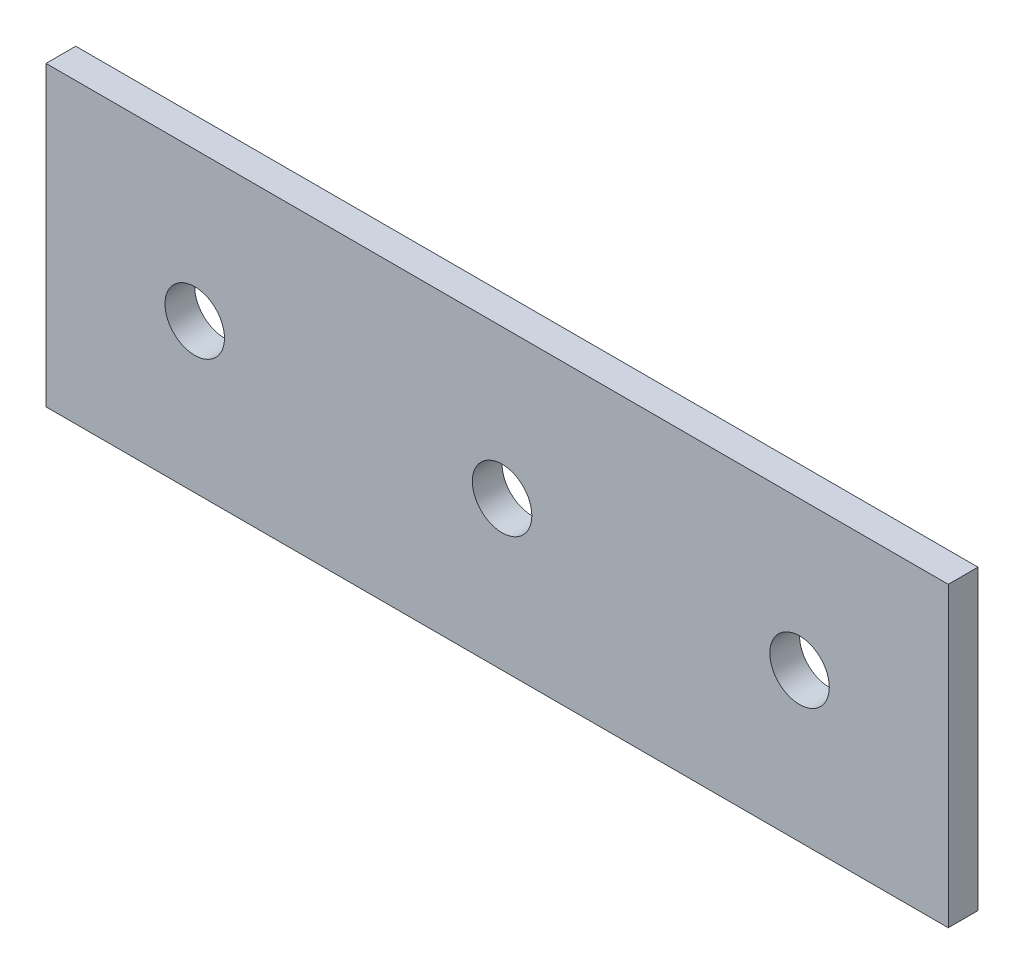
ISO-10303-21;
HEADER;
FILE_DESCRIPTION(('STEP AP214'),'2;1');
FILE_NAME('part.step','',(''),(''),'','','');
FILE_SCHEMA(('AUTOMOTIVE_DESIGN { 1 0 10303 214 1 1 1 1 }'));
ENDSEC;
DATA;
#1=APPLICATION_CONTEXT('core data for automotive mechanical design processes');
#2=APPLICATION_PROTOCOL_DEFINITION('international standard','automotive_design',2000,#1);
#3=PRODUCT_CONTEXT('',#1,'mechanical');
#4=PRODUCT('Part','Part','',(#3));
#5=PRODUCT_RELATED_PRODUCT_CATEGORY('part','',(#4));
#6=PRODUCT_DEFINITION_FORMATION('','',#4);
#7=PRODUCT_DEFINITION_CONTEXT('part definition',#1,'design');
#8=PRODUCT_DEFINITION('design','',#6,#7);
#9=PRODUCT_DEFINITION_SHAPE('','',#8);
#10=(LENGTH_UNIT() NAMED_UNIT(*) SI_UNIT(.MILLI.,.METRE.));
#11=(NAMED_UNIT(*) PLANE_ANGLE_UNIT() SI_UNIT($,.RADIAN.));
#12=(NAMED_UNIT(*) SI_UNIT($,.STERADIAN.) SOLID_ANGLE_UNIT());
#13=UNCERTAINTY_MEASURE_WITH_UNIT(LENGTH_MEASURE(1.E-05),#10,'distance_accuracy_value','');
#14=(GEOMETRIC_REPRESENTATION_CONTEXT(3) GLOBAL_UNCERTAINTY_ASSIGNED_CONTEXT((#13)) GLOBAL_UNIT_ASSIGNED_CONTEXT((#10,
#11,#12)) REPRESENTATION_CONTEXT('',''));
#15=CARTESIAN_POINT('',(0.,0.,0.));
#16=DIRECTION('',(0.,0.,1.));
#17=DIRECTION('',(1.,0.,0.));
#18=AXIS2_PLACEMENT_3D('',#15,#16,#17);
#19=CARTESIAN_POINT('',(-36.0672653272042,-0.000631578947363209,1.5));
#20=DIRECTION('',(0.,0.,1.));
#21=DIRECTION('',(1.,0.,0.));
#22=AXIS2_PLACEMENT_3D('',#19,#20,#21);
#23=PLANE('',#22);
#24=CARTESIAN_POINT('',(1.93273467279583,7.49936842105264,1.5));
#25=DIRECTION('',(0.,0.,1.));
#26=DIRECTION('',(1.,0.,0.));
#27=AXIS2_PLACEMENT_3D('',#24,#25,#26);
#28=CIRCLE('',#27,1.5);
#29=CARTESIAN_POINT('',(3.43273467279583,7.49936842105264,1.5));
#30=VERTEX_POINT('',#29);
#31=EDGE_CURVE('E113',#30,#30,#28,.T.);
#32=ORIENTED_EDGE('',*,*,#31,.F.);
#33=EDGE_LOOP('',(#32));
#34=FACE_BOUND('',#33,.T.);
#35=DIRECTION('',(0.,-1.,0.));
#36=VECTOR('',#35,1.);
#37=CARTESIAN_POINT('',(-36.0672653272042,14.9993684210526,1.5));
#38=LINE('',#37,#36);
#39=CARTESIAN_POINT('',(-36.0672653272042,14.9993684210526,1.5));
#40=VERTEX_POINT('',#39);
#41=CARTESIAN_POINT('',(-36.0672653272042,-0.000631578947363209,1.5));
#42=VERTEX_POINT('',#41);
#43=EDGE_CURVE('E83',#40,#42,#38,.T.);
#44=ORIENTED_EDGE('',*,*,#43,.T.);
#45=DIRECTION('',(1.,0.,0.));
#46=VECTOR('',#45,1.);
#47=CARTESIAN_POINT('',(-36.0672653272042,-0.000631578947363209,1.5));
#48=LINE('',#47,#46);
#49=CARTESIAN_POINT('',(9.43273467279583,-0.000631578947363209,1.5));
#50=VERTEX_POINT('',#49);
#51=EDGE_CURVE('E78',#42,#50,#48,.T.);
#52=ORIENTED_EDGE('',*,*,#51,.T.);
#53=DIRECTION('',(0.,1.,0.));
#54=VECTOR('',#53,1.);
#55=CARTESIAN_POINT('',(9.43273467279583,14.9993684210526,1.5));
#56=LINE('',#55,#54);
#57=CARTESIAN_POINT('',(9.43273467279583,14.9993684210526,1.5));
#58=VERTEX_POINT('',#57);
#59=EDGE_CURVE('E81',#50,#58,#56,.T.);
#60=ORIENTED_EDGE('',*,*,#59,.T.);
#61=DIRECTION('',(-1.,0.,0.));
#62=VECTOR('',#61,1.);
#63=CARTESIAN_POINT('',(-36.0672653272042,14.9993684210526,1.5));
#64=LINE('',#63,#62);
#65=EDGE_CURVE('E48',#58,#40,#64,.T.);
#66=ORIENTED_EDGE('',*,*,#65,.T.);
#67=EDGE_LOOP('',(#44,#52,#60,#66));
#68=FACE_BOUND('',#67,.T.);
#69=CARTESIAN_POINT('',(-28.5672653272042,7.49936842105264,1.5));
#70=DIRECTION('',(0.,0.,1.));
#71=DIRECTION('',(1.,0.,0.));
#72=AXIS2_PLACEMENT_3D('',#69,#70,#71);
#73=CIRCLE('',#72,1.5);
#74=CARTESIAN_POINT('',(-27.0672653272042,7.49936842105264,1.5));
#75=VERTEX_POINT('',#74);
#76=EDGE_CURVE('E98',#75,#75,#73,.T.);
#77=ORIENTED_EDGE('',*,*,#76,.F.);
#78=EDGE_LOOP('',(#77));
#79=FACE_BOUND('',#78,.T.);
#80=CARTESIAN_POINT('',(-13.0672653272042,7.49936842105264,1.5));
#81=DIRECTION('',(0.,0.,1.));
#82=DIRECTION('',(1.,0.,0.));
#83=AXIS2_PLACEMENT_3D('',#80,#81,#82);
#84=CIRCLE('',#83,1.5);
#85=CARTESIAN_POINT('',(-11.5672653272042,7.49936842105264,1.5));
#86=VERTEX_POINT('',#85);
#87=EDGE_CURVE('E119',#86,#86,#84,.T.);
#88=ORIENTED_EDGE('',*,*,#87,.F.);
#89=EDGE_LOOP('',(#88));
#90=FACE_BOUND('',#89,.T.);
#91=ADVANCED_FACE('F31',(#34,#68,#79,#90),#23,.T.);
#92=CARTESIAN_POINT('',(-36.0672653272042,-0.000631578947363209,0.));
#93=DIRECTION('',(0.,0.,1.));
#94=DIRECTION('',(1.,0.,0.));
#95=AXIS2_PLACEMENT_3D('',#92,#93,#94);
#96=PLANE('',#95);
#97=CARTESIAN_POINT('',(1.93273467279583,7.49936842105264,0.));
#98=DIRECTION('',(0.,0.,1.));
#99=DIRECTION('',(1.,0.,0.));
#100=AXIS2_PLACEMENT_3D('',#97,#98,#99);
#101=CIRCLE('',#100,1.5);
#102=CARTESIAN_POINT('',(3.43273467279583,7.49936842105264,0.));
#103=VERTEX_POINT('',#102);
#104=EDGE_CURVE('E116',#103,#103,#101,.T.);
#105=ORIENTED_EDGE('',*,*,#104,.T.);
#106=EDGE_LOOP('',(#105));
#107=FACE_BOUND('',#106,.T.);
#108=DIRECTION('',(0.,-1.,0.));
#109=VECTOR('',#108,1.);
#110=CARTESIAN_POINT('',(-36.0672653272042,14.9993684210526,0.));
#111=LINE('',#110,#109);
#112=CARTESIAN_POINT('',(-36.0672653272042,14.9993684210526,0.));
#113=VERTEX_POINT('',#112);
#114=CARTESIAN_POINT('',(-36.0672653272042,-0.000631578947363209,0.));
#115=VERTEX_POINT('',#114);
#116=EDGE_CURVE('E95',#113,#115,#111,.T.);
#117=ORIENTED_EDGE('',*,*,#116,.F.);
#118=DIRECTION('',(-1.,0.,0.));
#119=VECTOR('',#118,1.);
#120=CARTESIAN_POINT('',(-36.0672653272042,14.9993684210526,0.));
#121=LINE('',#120,#119);
#122=CARTESIAN_POINT('',(9.43273467279583,14.9993684210526,0.));
#123=VERTEX_POINT('',#122);
#124=EDGE_CURVE('E71',#123,#113,#121,.T.);
#125=ORIENTED_EDGE('',*,*,#124,.F.);
#126=DIRECTION('',(0.,1.,0.));
#127=VECTOR('',#126,1.);
#128=CARTESIAN_POINT('',(9.43273467279583,14.9993684210526,0.));
#129=LINE('',#128,#127);
#130=CARTESIAN_POINT('',(9.43273467279583,-0.000631578947363209,0.));
#131=VERTEX_POINT('',#130);
#132=EDGE_CURVE('E65',#131,#123,#129,.T.);
#133=ORIENTED_EDGE('',*,*,#132,.F.);
#134=DIRECTION('',(1.,0.,0.));
#135=VECTOR('',#134,1.);
#136=CARTESIAN_POINT('',(-36.0672653272042,-0.000631578947363209,0.));
#137=LINE('',#136,#135);
#138=EDGE_CURVE('E87',#115,#131,#137,.T.);
#139=ORIENTED_EDGE('',*,*,#138,.F.);
#140=EDGE_LOOP('',(#117,#125,#133,#139));
#141=FACE_BOUND('',#140,.T.);
#142=CARTESIAN_POINT('',(-28.5672653272042,7.49936842105264,0.));
#143=DIRECTION('',(0.,0.,1.));
#144=DIRECTION('',(1.,0.,0.));
#145=AXIS2_PLACEMENT_3D('',#142,#143,#144);
#146=CIRCLE('',#145,1.5);
#147=CARTESIAN_POINT('',(-27.0672653272042,7.49936842105264,0.));
#148=VERTEX_POINT('',#147);
#149=EDGE_CURVE('E110',#148,#148,#146,.T.);
#150=ORIENTED_EDGE('',*,*,#149,.T.);
#151=EDGE_LOOP('',(#150));
#152=FACE_BOUND('',#151,.T.);
#153=CARTESIAN_POINT('',(-13.0672653272042,7.49936842105264,0.));
#154=DIRECTION('',(0.,0.,1.));
#155=DIRECTION('',(1.,0.,0.));
#156=AXIS2_PLACEMENT_3D('',#153,#154,#155);
#157=CIRCLE('',#156,1.5);
#158=CARTESIAN_POINT('',(-11.5672653272042,7.49936842105264,0.));
#159=VERTEX_POINT('',#158);
#160=EDGE_CURVE('E122',#159,#159,#157,.T.);
#161=ORIENTED_EDGE('',*,*,#160,.T.);
#162=EDGE_LOOP('',(#161));
#163=FACE_BOUND('',#162,.T.);
#164=ADVANCED_FACE('F106',(#107,#141,#152,#163),#96,.F.);
#165=CARTESIAN_POINT('',(-36.0672653272042,14.9993684210526,1.5));
#166=DIRECTION('',(1.,0.,0.));
#167=DIRECTION('',(0.,1.,0.));
#168=AXIS2_PLACEMENT_3D('',#165,#166,#167);
#169=PLANE('',#168);
#170=ORIENTED_EDGE('',*,*,#116,.T.);
#171=DIRECTION('',(0.,0.,-1.));
#172=VECTOR('',#171,1.);
#173=CARTESIAN_POINT('',(-36.0672653272042,-0.000631578947363209,1.5));
#174=LINE('',#173,#172);
#175=EDGE_CURVE('E11',#42,#115,#174,.T.);
#176=ORIENTED_EDGE('',*,*,#175,.F.);
#177=ORIENTED_EDGE('',*,*,#43,.F.);
#178=DIRECTION('',(0.,0.,-1.));
#179=VECTOR('',#178,1.);
#180=CARTESIAN_POINT('',(-36.0672653272042,14.9993684210526,1.5));
#181=LINE('',#180,#179);
#182=EDGE_CURVE('E91',#40,#113,#181,.T.);
#183=ORIENTED_EDGE('',*,*,#182,.T.);
#184=EDGE_LOOP('',(#170,#176,#177,#183));
#185=FACE_BOUND('',#184,.T.);
#186=ADVANCED_FACE('F33',(#185),#169,.F.);
#187=CARTESIAN_POINT('',(-36.0672653272042,-0.000631578947363209,1.5));
#188=DIRECTION('',(0.,1.,0.));
#189=DIRECTION('',(0.,0.,1.));
#190=AXIS2_PLACEMENT_3D('',#187,#188,#189);
#191=PLANE('',#190);
#192=ORIENTED_EDGE('',*,*,#138,.T.);
#193=DIRECTION('',(0.,0.,-1.));
#194=VECTOR('',#193,1.);
#195=CARTESIAN_POINT('',(9.43273467279583,-0.000631578947363209,1.5));
#196=LINE('',#195,#194);
#197=EDGE_CURVE('E40',#50,#131,#196,.T.);
#198=ORIENTED_EDGE('',*,*,#197,.F.);
#199=ORIENTED_EDGE('',*,*,#51,.F.);
#200=ORIENTED_EDGE('',*,*,#175,.T.);
#201=EDGE_LOOP('',(#192,#198,#199,#200));
#202=FACE_BOUND('',#201,.T.);
#203=ADVANCED_FACE('F86',(#202),#191,.F.);
#204=CARTESIAN_POINT('',(9.43273467279583,14.9993684210526,1.5));
#205=DIRECTION('',(-1.,0.,0.));
#206=DIRECTION('',(0.,0.,1.));
#207=AXIS2_PLACEMENT_3D('',#204,#205,#206);
#208=PLANE('',#207);
#209=ORIENTED_EDGE('',*,*,#132,.T.);
#210=DIRECTION('',(0.,0.,-1.));
#211=VECTOR('',#210,1.);
#212=CARTESIAN_POINT('',(9.43273467279583,14.9993684210526,1.5));
#213=LINE('',#212,#211);
#214=EDGE_CURVE('E88',#58,#123,#213,.T.);
#215=ORIENTED_EDGE('',*,*,#214,.F.);
#216=ORIENTED_EDGE('',*,*,#59,.F.);
#217=ORIENTED_EDGE('',*,*,#197,.T.);
#218=EDGE_LOOP('',(#209,#215,#216,#217));
#219=FACE_BOUND('',#218,.T.);
#220=ADVANCED_FACE('F89',(#219),#208,.F.);
#221=CARTESIAN_POINT('',(-36.0672653272042,14.9993684210526,1.5));
#222=DIRECTION('',(0.,-1.,0.));
#223=DIRECTION('',(0.,0.,-1.));
#224=AXIS2_PLACEMENT_3D('',#221,#222,#223);
#225=PLANE('',#224);
#226=ORIENTED_EDGE('',*,*,#124,.T.);
#227=ORIENTED_EDGE('',*,*,#182,.F.);
#228=ORIENTED_EDGE('',*,*,#65,.F.);
#229=ORIENTED_EDGE('',*,*,#214,.T.);
#230=EDGE_LOOP('',(#226,#227,#228,#229));
#231=FACE_BOUND('',#230,.T.);
#232=ADVANCED_FACE('F103',(#231),#225,.F.);
#233=CARTESIAN_POINT('',(-28.5672653272042,7.49936842105264,1.5));
#234=DIRECTION('',(0.,0.,-1.));
#235=DIRECTION('',(-1.,0.,0.));
#236=AXIS2_PLACEMENT_3D('',#233,#234,#235);
#237=CYLINDRICAL_SURFACE('',#236,1.5);
#238=ORIENTED_EDGE('',*,*,#76,.T.);
#239=EDGE_LOOP('',(#238));
#240=FACE_BOUND('',#239,.T.);
#241=ORIENTED_EDGE('',*,*,#149,.F.);
#242=EDGE_LOOP('',(#241));
#243=FACE_BOUND('',#242,.T.);
#244=ADVANCED_FACE('F141',(#240,#243),#237,.F.);
#245=CARTESIAN_POINT('',(1.93273467279583,7.49936842105264,1.5));
#246=DIRECTION('',(0.,0.,-1.));
#247=DIRECTION('',(-1.,0.,0.));
#248=AXIS2_PLACEMENT_3D('',#245,#246,#247);
#249=CYLINDRICAL_SURFACE('',#248,1.5);
#250=ORIENTED_EDGE('',*,*,#31,.T.);
#251=EDGE_LOOP('',(#250));
#252=FACE_BOUND('',#251,.T.);
#253=ORIENTED_EDGE('',*,*,#104,.F.);
#254=EDGE_LOOP('',(#253));
#255=FACE_BOUND('',#254,.T.);
#256=ADVANCED_FACE('F187',(#252,#255),#249,.F.);
#257=CARTESIAN_POINT('',(-13.0672653272042,7.49936842105264,1.5));
#258=DIRECTION('',(0.,0.,-1.));
#259=DIRECTION('',(-1.,0.,0.));
#260=AXIS2_PLACEMENT_3D('',#257,#258,#259);
#261=CYLINDRICAL_SURFACE('',#260,1.5);
#262=ORIENTED_EDGE('',*,*,#87,.T.);
#263=EDGE_LOOP('',(#262));
#264=FACE_BOUND('',#263,.T.);
#265=ORIENTED_EDGE('',*,*,#160,.F.);
#266=EDGE_LOOP('',(#265));
#267=FACE_BOUND('',#266,.T.);
#268=ADVANCED_FACE('F128',(#264,#267),#261,.F.);
#269=CLOSED_SHELL('',(#91,#164,#186,#203,#220,#232,#244,#256,#268));
#270=MANIFOLD_SOLID_BREP('B2',#269);
#271=ADVANCED_BREP_SHAPE_REPRESENTATION('',(#18,#270),#14);
#272=SHAPE_DEFINITION_REPRESENTATION(#9,#271);
ENDSEC;
END-ISO-10303-21;
